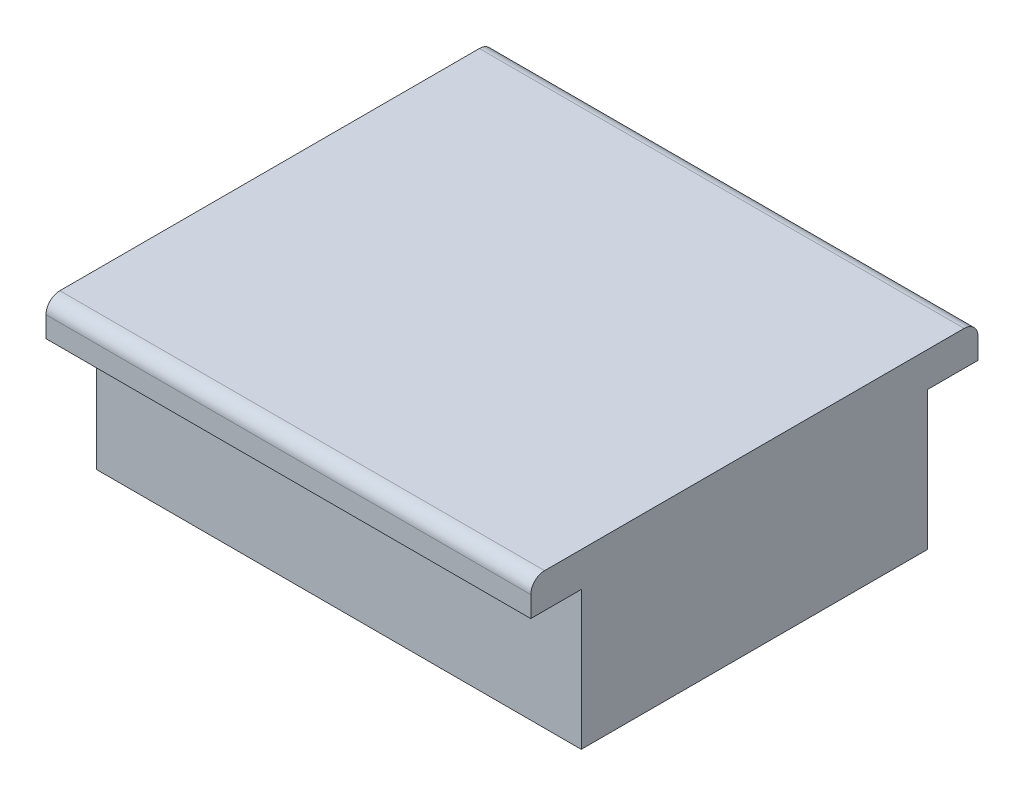
ISO-10303-21;
HEADER;
FILE_DESCRIPTION(('STEP AP214'),'2;1');
FILE_NAME('part.step','',(''),(''),'','','');
FILE_SCHEMA(('AUTOMOTIVE_DESIGN { 1 0 10303 214 1 1 1 1 }'));
ENDSEC;
DATA;
#1=APPLICATION_CONTEXT('core data for automotive mechanical design processes');
#2=APPLICATION_PROTOCOL_DEFINITION('international standard','automotive_design',2000,#1);
#3=PRODUCT_CONTEXT('',#1,'mechanical');
#4=PRODUCT('Part','Part','',(#3));
#5=PRODUCT_RELATED_PRODUCT_CATEGORY('part','',(#4));
#6=PRODUCT_DEFINITION_FORMATION('','',#4);
#7=PRODUCT_DEFINITION_CONTEXT('part definition',#1,'design');
#8=PRODUCT_DEFINITION('design','',#6,#7);
#9=PRODUCT_DEFINITION_SHAPE('','',#8);
#10=(LENGTH_UNIT() NAMED_UNIT(*) SI_UNIT(.MILLI.,.METRE.));
#11=(NAMED_UNIT(*) PLANE_ANGLE_UNIT() SI_UNIT($,.RADIAN.));
#12=(NAMED_UNIT(*) SI_UNIT($,.STERADIAN.) SOLID_ANGLE_UNIT());
#13=UNCERTAINTY_MEASURE_WITH_UNIT(LENGTH_MEASURE(1.E-05),#10,'distance_accuracy_value','');
#14=(GEOMETRIC_REPRESENTATION_CONTEXT(3) GLOBAL_UNCERTAINTY_ASSIGNED_CONTEXT((#13)) GLOBAL_UNIT_ASSIGNED_CONTEXT((#10,
#11,#12)) REPRESENTATION_CONTEXT('',''));
#15=CARTESIAN_POINT('',(0.,0.,0.));
#16=DIRECTION('',(0.,0.,1.));
#17=DIRECTION('',(1.,0.,0.));
#18=AXIS2_PLACEMENT_3D('',#15,#16,#17);
#19=CARTESIAN_POINT('',(1778.,508.,0.));
#20=DIRECTION('',(0.,0.,-1.));
#21=DIRECTION('',(0.,1.,0.));
#22=AXIS2_PLACEMENT_3D('',#19,#20,#21);
#23=PLANE('',#22);
#24=DIRECTION('',(0.,-1.,0.));
#25=VECTOR('',#24,1.);
#26=CARTESIAN_POINT('',(0.,508.,0.));
#27=LINE('',#26,#25);
#28=CARTESIAN_POINT('',(0.,508.,0.));
#29=VERTEX_POINT('',#28);
#30=CARTESIAN_POINT('',(0.,0.,0.));
#31=VERTEX_POINT('',#30);
#32=EDGE_CURVE('E150',#29,#31,#27,.T.);
#33=ORIENTED_EDGE('',*,*,#32,.T.);
#34=DIRECTION('',(-1.,0.,0.));
#35=VECTOR('',#34,1.);
#36=CARTESIAN_POINT('',(1778.,0.,0.));
#37=LINE('',#36,#35);
#38=CARTESIAN_POINT('',(1778.,0.,0.));
#39=VERTEX_POINT('',#38);
#40=EDGE_CURVE('E11',#39,#31,#37,.T.);
#41=ORIENTED_EDGE('',*,*,#40,.F.);
#42=DIRECTION('',(0.,-1.,0.));
#43=VECTOR('',#42,1.);
#44=CARTESIAN_POINT('',(1778.,508.,0.));
#45=LINE('',#44,#43);
#46=CARTESIAN_POINT('',(1778.,508.,0.));
#47=VERTEX_POINT('',#46);
#48=EDGE_CURVE('E164',#47,#39,#45,.T.);
#49=ORIENTED_EDGE('',*,*,#48,.F.);
#50=DIRECTION('',(-1.,0.,0.));
#51=VECTOR('',#50,1.);
#52=CARTESIAN_POINT('',(1778.,508.,0.));
#53=LINE('',#52,#51);
#54=EDGE_CURVE('E141',#47,#29,#53,.T.);
#55=ORIENTED_EDGE('',*,*,#54,.T.);
#56=EDGE_LOOP('',(#33,#41,#49,#55));
#57=FACE_BOUND('',#56,.T.);
#58=ADVANCED_FACE('F39',(#57),#23,.F.);
#59=CARTESIAN_POINT('',(1778.,0.,0.));
#60=DIRECTION('',(0.,1.,0.));
#61=DIRECTION('',(0.,0.,1.));
#62=AXIS2_PLACEMENT_3D('',#59,#60,#61);
#63=PLANE('',#62);
#64=DIRECTION('',(0.,0.,-1.));
#65=VECTOR('',#64,1.);
#66=CARTESIAN_POINT('',(0.,0.,0.));
#67=LINE('',#66,#65);
#68=CARTESIAN_POINT('',(0.,0.,-1270.));
#69=VERTEX_POINT('',#68);
#70=EDGE_CURVE('E147',#31,#69,#67,.T.);
#71=ORIENTED_EDGE('',*,*,#70,.T.);
#72=DIRECTION('',(-1.,0.,0.));
#73=VECTOR('',#72,1.);
#74=CARTESIAN_POINT('',(1778.,0.,-1270.));
#75=LINE('',#74,#73);
#76=CARTESIAN_POINT('',(1778.,0.,-1270.));
#77=VERTEX_POINT('',#76);
#78=EDGE_CURVE('E50',#77,#69,#75,.T.);
#79=ORIENTED_EDGE('',*,*,#78,.F.);
#80=DIRECTION('',(0.,0.,-1.));
#81=VECTOR('',#80,1.);
#82=CARTESIAN_POINT('',(1778.,0.,0.));
#83=LINE('',#82,#81);
#84=EDGE_CURVE('E102',#39,#77,#83,.T.);
#85=ORIENTED_EDGE('',*,*,#84,.F.);
#86=ORIENTED_EDGE('',*,*,#40,.T.);
#87=EDGE_LOOP('',(#71,#79,#85,#86));
#88=FACE_BOUND('',#87,.T.);
#89=ADVANCED_FACE('F212',(#88),#63,.F.);
#90=CARTESIAN_POINT('',(1778.,0.,-1270.));
#91=DIRECTION('',(0.,0.,1.));
#92=DIRECTION('',(1.,0.,0.));
#93=AXIS2_PLACEMENT_3D('',#90,#91,#92);
#94=PLANE('',#93);
#95=DIRECTION('',(0.,1.,0.));
#96=VECTOR('',#95,1.);
#97=CARTESIAN_POINT('',(0.,0.,-1270.));
#98=LINE('',#97,#96);
#99=CARTESIAN_POINT('',(0.,508.,-1270.));
#100=VERTEX_POINT('',#99);
#101=EDGE_CURVE('E155',#69,#100,#98,.T.);
#102=ORIENTED_EDGE('',*,*,#101,.T.);
#103=DIRECTION('',(-1.,0.,0.));
#104=VECTOR('',#103,1.);
#105=CARTESIAN_POINT('',(1778.,508.,-1270.));
#106=LINE('',#105,#104);
#107=CARTESIAN_POINT('',(1778.,508.,-1270.));
#108=VERTEX_POINT('',#107);
#109=EDGE_CURVE('E177',#108,#100,#106,.T.);
#110=ORIENTED_EDGE('',*,*,#109,.F.);
#111=DIRECTION('',(0.,1.,0.));
#112=VECTOR('',#111,1.);
#113=CARTESIAN_POINT('',(1778.,0.,-1270.));
#114=LINE('',#113,#112);
#115=EDGE_CURVE('E189',#77,#108,#114,.T.);
#116=ORIENTED_EDGE('',*,*,#115,.F.);
#117=ORIENTED_EDGE('',*,*,#78,.T.);
#118=EDGE_LOOP('',(#102,#110,#116,#117));
#119=FACE_BOUND('',#118,.T.);
#120=ADVANCED_FACE('F184',(#119),#94,.F.);
#121=CARTESIAN_POINT('',(1778.,508.,-1270.));
#122=DIRECTION('',(0.,1.,0.));
#123=DIRECTION('',(0.,0.,1.));
#124=AXIS2_PLACEMENT_3D('',#121,#122,#123);
#125=PLANE('',#124);
#126=DIRECTION('',(0.,0.,-1.));
#127=VECTOR('',#126,1.);
#128=CARTESIAN_POINT('',(0.,508.,-1270.));
#129=LINE('',#128,#127);
#130=CARTESIAN_POINT('',(0.,508.,-1455.09688289806));
#131=VERTEX_POINT('',#130);
#132=EDGE_CURVE('E152',#100,#131,#129,.T.);
#133=ORIENTED_EDGE('',*,*,#132,.T.);
#134=DIRECTION('',(-1.,0.,0.));
#135=VECTOR('',#134,1.);
#136=CARTESIAN_POINT('',(1778.,508.,-1455.09688289806));
#137=LINE('',#136,#135);
#138=CARTESIAN_POINT('',(1778.,508.,-1455.09688289806));
#139=VERTEX_POINT('',#138);
#140=EDGE_CURVE('E172',#139,#131,#137,.T.);
#141=ORIENTED_EDGE('',*,*,#140,.F.);
#142=DIRECTION('',(0.,0.,-1.));
#143=VECTOR('',#142,1.);
#144=CARTESIAN_POINT('',(1778.,508.,-1270.));
#145=LINE('',#144,#143);
#146=EDGE_CURVE('E204',#108,#139,#145,.T.);
#147=ORIENTED_EDGE('',*,*,#146,.F.);
#148=ORIENTED_EDGE('',*,*,#109,.T.);
#149=EDGE_LOOP('',(#133,#141,#147,#148));
#150=FACE_BOUND('',#149,.T.);
#151=ADVANCED_FACE('F194',(#150),#125,.F.);
#152=CARTESIAN_POINT('',(1778.,508.,-1455.09688289806));
#153=DIRECTION('',(0.,0.,1.));
#154=DIRECTION('',(1.,0.,0.));
#155=AXIS2_PLACEMENT_3D('',#152,#153,#154);
#156=PLANE('',#155);
#157=DIRECTION('',(0.,1.,0.));
#158=VECTOR('',#157,1.);
#159=CARTESIAN_POINT('',(0.,508.,-1455.09688289806));
#160=LINE('',#159,#158);
#161=CARTESIAN_POINT('',(0.,584.2,-1455.09688289806));
#162=VERTEX_POINT('',#161);
#163=EDGE_CURVE('E156',#131,#162,#160,.T.);
#164=ORIENTED_EDGE('',*,*,#163,.T.);
#165=DIRECTION('',(-1.,0.,0.));
#166=VECTOR('',#165,1.);
#167=CARTESIAN_POINT('',(1778.,584.2,-1455.09688289806));
#168=LINE('',#167,#166);
#169=CARTESIAN_POINT('',(1778.,584.2,-1455.09688289806));
#170=VERTEX_POINT('',#169);
#171=EDGE_CURVE('E171',#170,#162,#168,.T.);
#172=ORIENTED_EDGE('',*,*,#171,.F.);
#173=DIRECTION('',(0.,1.,0.));
#174=VECTOR('',#173,1.);
#175=CARTESIAN_POINT('',(1778.,508.,-1455.09688289806));
#176=LINE('',#175,#174);
#177=EDGE_CURVE('E203',#139,#170,#176,.T.);
#178=ORIENTED_EDGE('',*,*,#177,.F.);
#179=ORIENTED_EDGE('',*,*,#140,.T.);
#180=EDGE_LOOP('',(#164,#172,#178,#179));
#181=FACE_BOUND('',#180,.T.);
#182=ADVANCED_FACE('F200',(#181),#156,.F.);
#183=CARTESIAN_POINT('',(1778.,584.2,-1404.29688289806));
#184=DIRECTION('',(-1.,0.,0.));
#185=DIRECTION('',(0.,0.,1.));
#186=AXIS2_PLACEMENT_3D('',#183,#184,#185);
#187=CYLINDRICAL_SURFACE('',#186,50.8);
#188=CARTESIAN_POINT('',(0.,584.2,-1404.29688289806));
#189=DIRECTION('',(1.,0.,0.));
#190=DIRECTION('',(0.,0.,-1.));
#191=AXIS2_PLACEMENT_3D('',#188,#189,#190);
#192=CIRCLE('',#191,50.8);
#193=CARTESIAN_POINT('',(0.,635.,-1404.29688289806));
#194=VERTEX_POINT('',#193);
#195=EDGE_CURVE('E158',#162,#194,#192,.T.);
#196=ORIENTED_EDGE('',*,*,#195,.T.);
#197=DIRECTION('',(-1.,0.,0.));
#198=VECTOR('',#197,1.);
#199=CARTESIAN_POINT('',(1778.,635.,-1404.29688289806));
#200=LINE('',#199,#198);
#201=CARTESIAN_POINT('',(1778.,635.,-1404.29688289806));
#202=VERTEX_POINT('',#201);
#203=EDGE_CURVE('E166',#202,#194,#200,.T.);
#204=ORIENTED_EDGE('',*,*,#203,.F.);
#205=CARTESIAN_POINT('',(1778.,584.2,-1404.29688289806));
#206=DIRECTION('',(1.,0.,0.));
#207=DIRECTION('',(0.,0.,-1.));
#208=AXIS2_PLACEMENT_3D('',#205,#206,#207);
#209=CIRCLE('',#208,50.8);
#210=EDGE_CURVE('E201',#170,#202,#209,.T.);
#211=ORIENTED_EDGE('',*,*,#210,.F.);
#212=ORIENTED_EDGE('',*,*,#171,.T.);
#213=EDGE_LOOP('',(#196,#204,#211,#212));
#214=FACE_BOUND('',#213,.T.);
#215=ADVANCED_FACE('F229',(#214),#187,.T.);
#216=CARTESIAN_POINT('',(1778.,635.,-1404.29688289806));
#217=DIRECTION('',(0.,-1.,0.));
#218=DIRECTION('',(0.,0.,-1.));
#219=AXIS2_PLACEMENT_3D('',#216,#217,#218);
#220=PLANE('',#219);
#221=DIRECTION('',(0.,0.,1.));
#222=VECTOR('',#221,1.);
#223=CARTESIAN_POINT('',(0.,635.,-1404.29688289806));
#224=LINE('',#223,#222);
#225=CARTESIAN_POINT('',(0.,635.,134.296882898062));
#226=VERTEX_POINT('',#225);
#227=EDGE_CURVE('E159',#194,#226,#224,.T.);
#228=ORIENTED_EDGE('',*,*,#227,.T.);
#229=DIRECTION('',(-1.,0.,0.));
#230=VECTOR('',#229,1.);
#231=CARTESIAN_POINT('',(1778.,635.,134.296882898062));
#232=LINE('',#231,#230);
#233=CARTESIAN_POINT('',(1778.,635.,134.296882898062));
#234=VERTEX_POINT('',#233);
#235=EDGE_CURVE('E137',#234,#226,#232,.T.);
#236=ORIENTED_EDGE('',*,*,#235,.F.);
#237=DIRECTION('',(0.,0.,1.));
#238=VECTOR('',#237,1.);
#239=CARTESIAN_POINT('',(1778.,635.,-1404.29688289806));
#240=LINE('',#239,#238);
#241=EDGE_CURVE('E129',#202,#234,#240,.T.);
#242=ORIENTED_EDGE('',*,*,#241,.F.);
#243=ORIENTED_EDGE('',*,*,#203,.T.);
#244=EDGE_LOOP('',(#228,#236,#242,#243));
#245=FACE_BOUND('',#244,.T.);
#246=ADVANCED_FACE('F228',(#245),#220,.F.);
#247=CARTESIAN_POINT('',(1778.,584.2,134.296882898062));
#248=DIRECTION('',(-1.,0.,0.));
#249=DIRECTION('',(0.,0.,1.));
#250=AXIS2_PLACEMENT_3D('',#247,#248,#249);
#251=CYLINDRICAL_SURFACE('',#250,50.8);
#252=CARTESIAN_POINT('',(0.,584.2,134.296882898062));
#253=DIRECTION('',(1.,0.,0.));
#254=DIRECTION('',(0.,0.,-1.));
#255=AXIS2_PLACEMENT_3D('',#252,#253,#254);
#256=CIRCLE('',#255,50.8);
#257=CARTESIAN_POINT('',(0.,584.2,185.096882898062));
#258=VERTEX_POINT('',#257);
#259=EDGE_CURVE('E140',#226,#258,#256,.T.);
#260=ORIENTED_EDGE('',*,*,#259,.T.);
#261=DIRECTION('',(-1.,0.,0.));
#262=VECTOR('',#261,1.);
#263=CARTESIAN_POINT('',(1778.,584.2,185.096882898062));
#264=LINE('',#263,#262);
#265=CARTESIAN_POINT('',(1778.,584.2,185.096882898062));
#266=VERTEX_POINT('',#265);
#267=EDGE_CURVE('E133',#266,#258,#264,.T.);
#268=ORIENTED_EDGE('',*,*,#267,.F.);
#269=CARTESIAN_POINT('',(1778.,584.2,134.296882898062));
#270=DIRECTION('',(1.,0.,0.));
#271=DIRECTION('',(0.,0.,-1.));
#272=AXIS2_PLACEMENT_3D('',#269,#270,#271);
#273=CIRCLE('',#272,50.8);
#274=EDGE_CURVE('E122',#234,#266,#273,.T.);
#275=ORIENTED_EDGE('',*,*,#274,.F.);
#276=ORIENTED_EDGE('',*,*,#235,.T.);
#277=EDGE_LOOP('',(#260,#268,#275,#276));
#278=FACE_BOUND('',#277,.T.);
#279=ADVANCED_FACE('F132',(#278),#251,.T.);
#280=CARTESIAN_POINT('',(1778.,584.2,185.096882898062));
#281=DIRECTION('',(0.,0.,-1.));
#282=DIRECTION('',(0.,1.,0.));
#283=AXIS2_PLACEMENT_3D('',#280,#281,#282);
#284=PLANE('',#283);
#285=DIRECTION('',(0.,-1.,0.));
#286=VECTOR('',#285,1.);
#287=CARTESIAN_POINT('',(0.,584.2,185.096882898062));
#288=LINE('',#287,#286);
#289=CARTESIAN_POINT('',(0.,508.,185.096882898062));
#290=VERTEX_POINT('',#289);
#291=EDGE_CURVE('E89',#258,#290,#288,.T.);
#292=ORIENTED_EDGE('',*,*,#291,.T.);
#293=DIRECTION('',(-1.,0.,0.));
#294=VECTOR('',#293,1.);
#295=CARTESIAN_POINT('',(1778.,508.,185.096882898062));
#296=LINE('',#295,#294);
#297=CARTESIAN_POINT('',(1778.,508.,185.096882898062));
#298=VERTEX_POINT('',#297);
#299=EDGE_CURVE('E138',#298,#290,#296,.T.);
#300=ORIENTED_EDGE('',*,*,#299,.F.);
#301=DIRECTION('',(0.,-1.,0.));
#302=VECTOR('',#301,1.);
#303=CARTESIAN_POINT('',(1778.,584.2,185.096882898062));
#304=LINE('',#303,#302);
#305=EDGE_CURVE('E130',#266,#298,#304,.T.);
#306=ORIENTED_EDGE('',*,*,#305,.F.);
#307=ORIENTED_EDGE('',*,*,#267,.T.);
#308=EDGE_LOOP('',(#292,#300,#306,#307));
#309=FACE_BOUND('',#308,.T.);
#310=ADVANCED_FACE('F143',(#309),#284,.F.);
#311=CARTESIAN_POINT('',(1778.,508.,185.096882898062));
#312=DIRECTION('',(0.,1.,0.));
#313=DIRECTION('',(0.,0.,1.));
#314=AXIS2_PLACEMENT_3D('',#311,#312,#313);
#315=PLANE('',#314);
#316=DIRECTION('',(0.,0.,-1.));
#317=VECTOR('',#316,1.);
#318=CARTESIAN_POINT('',(0.,508.,185.096882898062));
#319=LINE('',#318,#317);
#320=EDGE_CURVE('E96',#290,#29,#319,.T.);
#321=ORIENTED_EDGE('',*,*,#320,.T.);
#322=ORIENTED_EDGE('',*,*,#54,.F.);
#323=DIRECTION('',(0.,0.,-1.));
#324=VECTOR('',#323,1.);
#325=CARTESIAN_POINT('',(1778.,508.,185.096882898062));
#326=LINE('',#325,#324);
#327=EDGE_CURVE('E54',#298,#47,#326,.T.);
#328=ORIENTED_EDGE('',*,*,#327,.F.);
#329=ORIENTED_EDGE('',*,*,#299,.T.);
#330=EDGE_LOOP('',(#321,#322,#328,#329));
#331=FACE_BOUND('',#330,.T.);
#332=ADVANCED_FACE('F236',(#331),#315,.F.);
#333=CARTESIAN_POINT('',(1778.,584.2,-1404.29688289806));
#334=DIRECTION('',(1.,0.,0.));
#335=DIRECTION('',(0.,0.,-1.));
#336=AXIS2_PLACEMENT_3D('',#333,#334,#335);
#337=PLANE('',#336);
#338=ORIENTED_EDGE('',*,*,#48,.T.);
#339=ORIENTED_EDGE('',*,*,#84,.T.);
#340=ORIENTED_EDGE('',*,*,#115,.T.);
#341=ORIENTED_EDGE('',*,*,#146,.T.);
#342=ORIENTED_EDGE('',*,*,#177,.T.);
#343=ORIENTED_EDGE('',*,*,#210,.T.);
#344=ORIENTED_EDGE('',*,*,#241,.T.);
#345=ORIENTED_EDGE('',*,*,#274,.T.);
#346=ORIENTED_EDGE('',*,*,#305,.T.);
#347=ORIENTED_EDGE('',*,*,#327,.T.);
#348=EDGE_LOOP('',(#338,#339,#340,#341,#342,#343,#344,#345,#346,#347));
#349=FACE_BOUND('',#348,.T.);
#350=ADVANCED_FACE('F124',(#349),#337,.T.);
#351=CARTESIAN_POINT('',(0.,584.2,-1404.29688289806));
#352=DIRECTION('',(1.,0.,0.));
#353=DIRECTION('',(0.,0.,-1.));
#354=AXIS2_PLACEMENT_3D('',#351,#352,#353);
#355=PLANE('',#354);
#356=ORIENTED_EDGE('',*,*,#32,.F.);
#357=ORIENTED_EDGE('',*,*,#320,.F.);
#358=ORIENTED_EDGE('',*,*,#291,.F.);
#359=ORIENTED_EDGE('',*,*,#259,.F.);
#360=ORIENTED_EDGE('',*,*,#227,.F.);
#361=ORIENTED_EDGE('',*,*,#195,.F.);
#362=ORIENTED_EDGE('',*,*,#163,.F.);
#363=ORIENTED_EDGE('',*,*,#132,.F.);
#364=ORIENTED_EDGE('',*,*,#101,.F.);
#365=ORIENTED_EDGE('',*,*,#70,.F.);
#366=EDGE_LOOP('',(#356,#357,#358,#359,#360,#361,#362,#363,#364,#365));
#367=FACE_BOUND('',#366,.T.);
#368=ADVANCED_FACE('F187',(#367),#355,.F.);
#369=CLOSED_SHELL('',(#58,#89,#120,#151,#182,#215,#246,#279,#310,#332,#350,#368));
#370=MANIFOLD_SOLID_BREP('B2',#369);
#371=ADVANCED_BREP_SHAPE_REPRESENTATION('',(#18,#370),#14);
#372=SHAPE_DEFINITION_REPRESENTATION(#9,#371);
ENDSEC;
END-ISO-10303-21;
